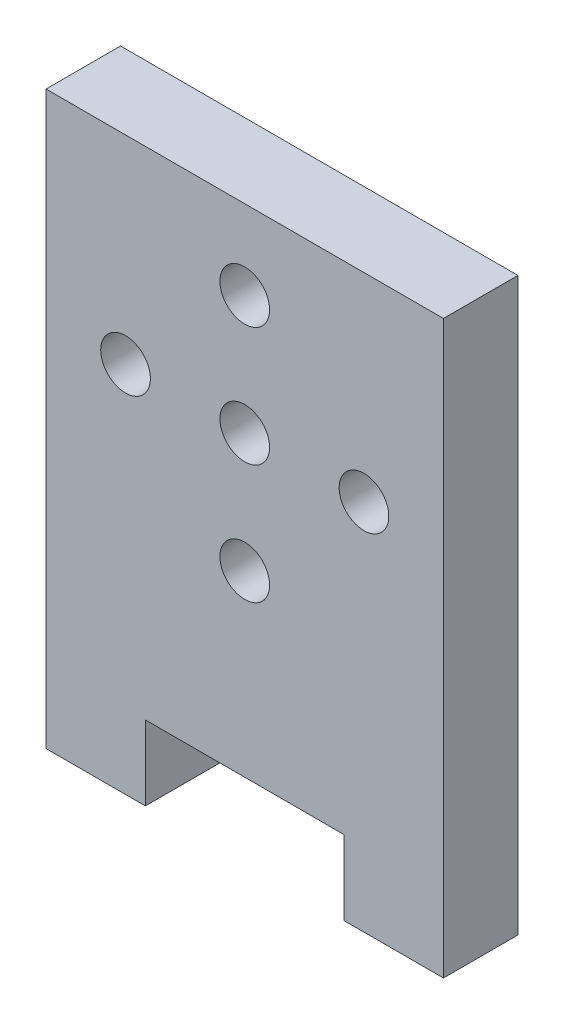
ISO-10303-21;
HEADER;
FILE_DESCRIPTION(('STEP AP214'),'2;1');
FILE_NAME('part.step','',(''),(''),'','','');
FILE_SCHEMA(('AUTOMOTIVE_DESIGN { 1 0 10303 214 1 1 1 1 }'));
ENDSEC;
DATA;
#1=APPLICATION_CONTEXT('core data for automotive mechanical design processes');
#2=APPLICATION_PROTOCOL_DEFINITION('international standard','automotive_design',2000,#1);
#3=PRODUCT_CONTEXT('',#1,'mechanical');
#4=PRODUCT('Part','Part','',(#3));
#5=PRODUCT_RELATED_PRODUCT_CATEGORY('part','',(#4));
#6=PRODUCT_DEFINITION_FORMATION('','',#4);
#7=PRODUCT_DEFINITION_CONTEXT('part definition',#1,'design');
#8=PRODUCT_DEFINITION('design','',#6,#7);
#9=PRODUCT_DEFINITION_SHAPE('','',#8);
#10=(LENGTH_UNIT() NAMED_UNIT(*) SI_UNIT(.MILLI.,.METRE.));
#11=(NAMED_UNIT(*) PLANE_ANGLE_UNIT() SI_UNIT($,.RADIAN.));
#12=(NAMED_UNIT(*) SI_UNIT($,.STERADIAN.) SOLID_ANGLE_UNIT());
#13=UNCERTAINTY_MEASURE_WITH_UNIT(LENGTH_MEASURE(1.E-05),#10,'distance_accuracy_value','');
#14=(GEOMETRIC_REPRESENTATION_CONTEXT(3) GLOBAL_UNCERTAINTY_ASSIGNED_CONTEXT((#13)) GLOBAL_UNIT_ASSIGNED_CONTEXT((#10,
#11,#12)) REPRESENTATION_CONTEXT('',''));
#15=CARTESIAN_POINT('',(0.,0.,0.));
#16=DIRECTION('',(0.,0.,1.));
#17=DIRECTION('',(1.,0.,0.));
#18=AXIS2_PLACEMENT_3D('',#15,#16,#17);
#19=CARTESIAN_POINT('',(0.,0.,4.7625));
#20=DIRECTION('',(0.,0.,-1.));
#21=DIRECTION('',(-1.,0.,0.));
#22=AXIS2_PLACEMENT_3D('',#19,#20,#21);
#23=PLANE('',#22);
#24=DIRECTION('',(0.,1.,0.));
#25=VECTOR('',#24,1.);
#26=CARTESIAN_POINT('',(0.,-4.7625,4.7625));
#27=LINE('',#26,#25);
#28=CARTESIAN_POINT('',(0.,-4.7625,4.7625));
#29=VERTEX_POINT('',#28);
#30=CARTESIAN_POINT('',(0.,0.,4.7625));
#31=VERTEX_POINT('',#30);
#32=EDGE_CURVE('E144',#29,#31,#27,.T.);
#33=ORIENTED_EDGE('',*,*,#32,.T.);
#34=DIRECTION('',(1.,0.,0.));
#35=VECTOR('',#34,1.);
#36=CARTESIAN_POINT('',(0.,0.,4.7625));
#37=LINE('',#36,#35);
#38=CARTESIAN_POINT('',(12.7,0.,4.7625));
#39=VERTEX_POINT('',#38);
#40=EDGE_CURVE('E92',#31,#39,#37,.T.);
#41=ORIENTED_EDGE('',*,*,#40,.T.);
#42=DIRECTION('',(0.,-1.,0.));
#43=VECTOR('',#42,1.);
#44=CARTESIAN_POINT('',(12.7,0.,4.7625));
#45=LINE('',#44,#43);
#46=CARTESIAN_POINT('',(12.7,-4.7625,4.7625));
#47=VERTEX_POINT('',#46);
#48=EDGE_CURVE('E159',#39,#47,#45,.T.);
#49=ORIENTED_EDGE('',*,*,#48,.T.);
#50=DIRECTION('',(1.,0.,0.));
#51=VECTOR('',#50,1.);
#52=CARTESIAN_POINT('',(12.7,-4.7625,4.7625));
#53=LINE('',#52,#51);
#54=CARTESIAN_POINT('',(19.05,-4.7625,4.7625));
#55=VERTEX_POINT('',#54);
#56=EDGE_CURVE('E172',#47,#55,#53,.T.);
#57=ORIENTED_EDGE('',*,*,#56,.T.);
#58=DIRECTION('',(0.,1.,0.));
#59=VECTOR('',#58,1.);
#60=CARTESIAN_POINT('',(19.05,-4.7625,4.7625));
#61=LINE('',#60,#59);
#62=CARTESIAN_POINT('',(19.05,31.75,4.7625));
#63=VERTEX_POINT('',#62);
#64=EDGE_CURVE('E111',#55,#63,#61,.T.);
#65=ORIENTED_EDGE('',*,*,#64,.T.);
#66=DIRECTION('',(-1.,0.,0.));
#67=VECTOR('',#66,1.);
#68=CARTESIAN_POINT('',(19.05,31.75,4.7625));
#69=LINE('',#68,#67);
#70=CARTESIAN_POINT('',(-6.35,31.75,4.7625));
#71=VERTEX_POINT('',#70);
#72=EDGE_CURVE('E105',#63,#71,#69,.T.);
#73=ORIENTED_EDGE('',*,*,#72,.T.);
#74=DIRECTION('',(0.,-1.,0.));
#75=VECTOR('',#74,1.);
#76=CARTESIAN_POINT('',(-6.35,31.75,4.7625));
#77=LINE('',#76,#75);
#78=CARTESIAN_POINT('',(-6.35,-4.7625,4.7625));
#79=VERTEX_POINT('',#78);
#80=EDGE_CURVE('E109',#71,#79,#77,.T.);
#81=ORIENTED_EDGE('',*,*,#80,.T.);
#82=DIRECTION('',(1.,0.,0.));
#83=VECTOR('',#82,1.);
#84=CARTESIAN_POINT('',(-6.35,-4.7625,4.7625));
#85=LINE('',#84,#83);
#86=EDGE_CURVE('E49',#79,#29,#85,.T.);
#87=ORIENTED_EDGE('',*,*,#86,.T.);
#88=EDGE_LOOP('',(#33,#41,#49,#57,#65,#73,#81,#87));
#89=FACE_BOUND('',#88,.T.);
#90=CARTESIAN_POINT('',(6.35,19.05,4.7625));
#91=DIRECTION('',(0.,0.,1.));
#92=DIRECTION('',(1.,0.,0.));
#93=AXIS2_PLACEMENT_3D('',#90,#91,#92);
#94=CIRCLE('',#93,1.5875);
#95=CARTESIAN_POINT('',(4.7625,19.05,4.7625));
#96=VERTEX_POINT('',#95);
#97=EDGE_CURVE('E133',#96,#96,#94,.T.);
#98=ORIENTED_EDGE('',*,*,#97,.F.);
#99=EDGE_LOOP('',(#98));
#100=FACE_BOUND('',#99,.T.);
#101=CARTESIAN_POINT('',(6.35,26.67,4.7625));
#102=DIRECTION('',(0.,0.,1.));
#103=DIRECTION('',(1.,0.,0.));
#104=AXIS2_PLACEMENT_3D('',#101,#102,#103);
#105=CIRCLE('',#104,1.5875);
#106=CARTESIAN_POINT('',(4.7625,26.67,4.7625));
#107=VERTEX_POINT('',#106);
#108=EDGE_CURVE('E181',#107,#107,#105,.T.);
#109=ORIENTED_EDGE('',*,*,#108,.F.);
#110=EDGE_LOOP('',(#109));
#111=FACE_BOUND('',#110,.T.);
#112=CARTESIAN_POINT('',(13.97,19.05,4.7625));
#113=DIRECTION('',(0.,0.,1.));
#114=DIRECTION('',(1.,0.,0.));
#115=AXIS2_PLACEMENT_3D('',#112,#113,#114);
#116=CIRCLE('',#115,1.5875);
#117=CARTESIAN_POINT('',(12.3825,19.05,4.7625));
#118=VERTEX_POINT('',#117);
#119=EDGE_CURVE('E187',#118,#118,#116,.T.);
#120=ORIENTED_EDGE('',*,*,#119,.F.);
#121=EDGE_LOOP('',(#120));
#122=FACE_BOUND('',#121,.T.);
#123=CARTESIAN_POINT('',(-1.27,19.05,4.7625));
#124=DIRECTION('',(0.,0.,1.));
#125=DIRECTION('',(1.,0.,0.));
#126=AXIS2_PLACEMENT_3D('',#123,#124,#125);
#127=CIRCLE('',#126,1.5875);
#128=CARTESIAN_POINT('',(-2.8575,19.05,4.7625));
#129=VERTEX_POINT('',#128);
#130=EDGE_CURVE('E193',#129,#129,#127,.T.);
#131=ORIENTED_EDGE('',*,*,#130,.F.);
#132=EDGE_LOOP('',(#131));
#133=FACE_BOUND('',#132,.T.);
#134=CARTESIAN_POINT('',(6.35,11.43,4.7625));
#135=DIRECTION('',(0.,0.,1.));
#136=DIRECTION('',(1.,0.,0.));
#137=AXIS2_PLACEMENT_3D('',#134,#135,#136);
#138=CIRCLE('',#137,1.5875);
#139=CARTESIAN_POINT('',(4.7625,11.43,4.7625));
#140=VERTEX_POINT('',#139);
#141=EDGE_CURVE('E199',#140,#140,#138,.T.);
#142=ORIENTED_EDGE('',*,*,#141,.F.);
#143=EDGE_LOOP('',(#142));
#144=FACE_BOUND('',#143,.T.);
#145=ADVANCED_FACE('F32',(#89,#100,#111,#122,#133,#144),#23,.F.);
#146=CARTESIAN_POINT('',(0.,0.,0.));
#147=DIRECTION('',(0.,0.,-1.));
#148=DIRECTION('',(-1.,0.,0.));
#149=AXIS2_PLACEMENT_3D('',#146,#147,#148);
#150=PLANE('',#149);
#151=CARTESIAN_POINT('',(-1.27,19.05,0.));
#152=DIRECTION('',(0.,0.,1.));
#153=DIRECTION('',(1.,0.,0.));
#154=AXIS2_PLACEMENT_3D('',#151,#152,#153);
#155=CIRCLE('',#154,1.5875);
#156=CARTESIAN_POINT('',(-2.8575,19.05,0.));
#157=VERTEX_POINT('',#156);
#158=EDGE_CURVE('E196',#157,#157,#155,.T.);
#159=ORIENTED_EDGE('',*,*,#158,.T.);
#160=EDGE_LOOP('',(#159));
#161=FACE_BOUND('',#160,.T.);
#162=CARTESIAN_POINT('',(6.35,26.67,0.));
#163=DIRECTION('',(0.,0.,1.));
#164=DIRECTION('',(1.,0.,0.));
#165=AXIS2_PLACEMENT_3D('',#162,#163,#164);
#166=CIRCLE('',#165,1.5875);
#167=CARTESIAN_POINT('',(4.7625,26.67,0.));
#168=VERTEX_POINT('',#167);
#169=EDGE_CURVE('E184',#168,#168,#166,.T.);
#170=ORIENTED_EDGE('',*,*,#169,.T.);
#171=EDGE_LOOP('',(#170));
#172=FACE_BOUND('',#171,.T.);
#173=DIRECTION('',(0.,1.,0.));
#174=VECTOR('',#173,1.);
#175=CARTESIAN_POINT('',(0.,-4.7625,0.));
#176=LINE('',#175,#174);
#177=CARTESIAN_POINT('',(0.,-4.7625,0.));
#178=VERTEX_POINT('',#177);
#179=CARTESIAN_POINT('',(0.,0.,0.));
#180=VERTEX_POINT('',#179);
#181=EDGE_CURVE('E129',#178,#180,#176,.T.);
#182=ORIENTED_EDGE('',*,*,#181,.F.);
#183=DIRECTION('',(1.,0.,0.));
#184=VECTOR('',#183,1.);
#185=CARTESIAN_POINT('',(-6.35,-4.7625,0.));
#186=LINE('',#185,#184);
#187=CARTESIAN_POINT('',(-6.35,-4.7625,0.));
#188=VERTEX_POINT('',#187);
#189=EDGE_CURVE('E84',#188,#178,#186,.T.);
#190=ORIENTED_EDGE('',*,*,#189,.F.);
#191=DIRECTION('',(0.,-1.,0.));
#192=VECTOR('',#191,1.);
#193=CARTESIAN_POINT('',(-6.35,31.75,0.));
#194=LINE('',#193,#192);
#195=CARTESIAN_POINT('',(-6.35,31.75,0.));
#196=VERTEX_POINT('',#195);
#197=EDGE_CURVE('E78',#196,#188,#194,.T.);
#198=ORIENTED_EDGE('',*,*,#197,.F.);
#199=DIRECTION('',(-1.,0.,0.));
#200=VECTOR('',#199,1.);
#201=CARTESIAN_POINT('',(19.05,31.75,0.));
#202=LINE('',#201,#200);
#203=CARTESIAN_POINT('',(19.05,31.75,0.));
#204=VERTEX_POINT('',#203);
#205=EDGE_CURVE('E119',#204,#196,#202,.T.);
#206=ORIENTED_EDGE('',*,*,#205,.F.);
#207=DIRECTION('',(0.,1.,0.));
#208=VECTOR('',#207,1.);
#209=CARTESIAN_POINT('',(19.05,-4.7625,0.));
#210=LINE('',#209,#208);
#211=CARTESIAN_POINT('',(19.05,-4.7625,0.));
#212=VERTEX_POINT('',#211);
#213=EDGE_CURVE('E139',#212,#204,#210,.T.);
#214=ORIENTED_EDGE('',*,*,#213,.F.);
#215=DIRECTION('',(1.,0.,0.));
#216=VECTOR('',#215,1.);
#217=CARTESIAN_POINT('',(12.7,-4.7625,0.));
#218=LINE('',#217,#216);
#219=CARTESIAN_POINT('',(12.7,-4.7625,0.));
#220=VERTEX_POINT('',#219);
#221=EDGE_CURVE('E137',#220,#212,#218,.T.);
#222=ORIENTED_EDGE('',*,*,#221,.F.);
#223=DIRECTION('',(0.,-1.,0.));
#224=VECTOR('',#223,1.);
#225=CARTESIAN_POINT('',(12.7,0.,0.));
#226=LINE('',#225,#224);
#227=CARTESIAN_POINT('',(12.7,0.,0.));
#228=VERTEX_POINT('',#227);
#229=EDGE_CURVE('E135',#228,#220,#226,.T.);
#230=ORIENTED_EDGE('',*,*,#229,.F.);
#231=DIRECTION('',(1.,0.,0.));
#232=VECTOR('',#231,1.);
#233=CARTESIAN_POINT('',(0.,0.,0.));
#234=LINE('',#233,#232);
#235=EDGE_CURVE('E132',#180,#228,#234,.T.);
#236=ORIENTED_EDGE('',*,*,#235,.F.);
#237=EDGE_LOOP('',(#182,#190,#198,#206,#214,#222,#230,#236));
#238=FACE_BOUND('',#237,.T.);
#239=CARTESIAN_POINT('',(6.35,19.05,0.));
#240=DIRECTION('',(0.,0.,1.));
#241=DIRECTION('',(1.,0.,0.));
#242=AXIS2_PLACEMENT_3D('',#239,#240,#241);
#243=CIRCLE('',#242,1.5875);
#244=CARTESIAN_POINT('',(4.7625,19.05,0.));
#245=VERTEX_POINT('',#244);
#246=EDGE_CURVE('E178',#245,#245,#243,.T.);
#247=ORIENTED_EDGE('',*,*,#246,.T.);
#248=EDGE_LOOP('',(#247));
#249=FACE_BOUND('',#248,.T.);
#250=CARTESIAN_POINT('',(13.97,19.05,0.));
#251=DIRECTION('',(0.,0.,1.));
#252=DIRECTION('',(1.,0.,0.));
#253=AXIS2_PLACEMENT_3D('',#250,#251,#252);
#254=CIRCLE('',#253,1.5875);
#255=CARTESIAN_POINT('',(12.3825,19.05,0.));
#256=VERTEX_POINT('',#255);
#257=EDGE_CURVE('E190',#256,#256,#254,.T.);
#258=ORIENTED_EDGE('',*,*,#257,.T.);
#259=EDGE_LOOP('',(#258));
#260=FACE_BOUND('',#259,.T.);
#261=CARTESIAN_POINT('',(6.35,11.43,0.));
#262=DIRECTION('',(0.,0.,1.));
#263=DIRECTION('',(1.,0.,0.));
#264=AXIS2_PLACEMENT_3D('',#261,#262,#263);
#265=CIRCLE('',#264,1.5875);
#266=CARTESIAN_POINT('',(4.7625,11.43,0.));
#267=VERTEX_POINT('',#266);
#268=EDGE_CURVE('E202',#267,#267,#265,.T.);
#269=ORIENTED_EDGE('',*,*,#268,.T.);
#270=EDGE_LOOP('',(#269));
#271=FACE_BOUND('',#270,.T.);
#272=ADVANCED_FACE('F163',(#161,#172,#238,#249,#260,#271),#150,.T.);
#273=CARTESIAN_POINT('',(0.,-4.7625,4.7625));
#274=DIRECTION('',(-1.,0.,0.));
#275=DIRECTION('',(0.,0.,1.));
#276=AXIS2_PLACEMENT_3D('',#273,#274,#275);
#277=PLANE('',#276);
#278=ORIENTED_EDGE('',*,*,#181,.T.);
#279=DIRECTION('',(0.,0.,-1.));
#280=VECTOR('',#279,1.);
#281=CARTESIAN_POINT('',(0.,0.,4.7625));
#282=LINE('',#281,#280);
#283=EDGE_CURVE('E11',#31,#180,#282,.T.);
#284=ORIENTED_EDGE('',*,*,#283,.F.);
#285=ORIENTED_EDGE('',*,*,#32,.F.);
#286=DIRECTION('',(0.,0.,-1.));
#287=VECTOR('',#286,1.);
#288=CARTESIAN_POINT('',(0.,-4.7625,4.7625));
#289=LINE('',#288,#287);
#290=EDGE_CURVE('E125',#29,#178,#289,.T.);
#291=ORIENTED_EDGE('',*,*,#290,.T.);
#292=EDGE_LOOP('',(#278,#284,#285,#291));
#293=FACE_BOUND('',#292,.T.);
#294=ADVANCED_FACE('F34',(#293),#277,.F.);
#295=CARTESIAN_POINT('',(0.,0.,4.7625));
#296=DIRECTION('',(0.,1.,0.));
#297=DIRECTION('',(0.,0.,1.));
#298=AXIS2_PLACEMENT_3D('',#295,#296,#297);
#299=PLANE('',#298);
#300=ORIENTED_EDGE('',*,*,#235,.T.);
#301=DIRECTION('',(0.,0.,-1.));
#302=VECTOR('',#301,1.);
#303=CARTESIAN_POINT('',(12.7,0.,4.7625));
#304=LINE('',#303,#302);
#305=EDGE_CURVE('E41',#39,#228,#304,.T.);
#306=ORIENTED_EDGE('',*,*,#305,.F.);
#307=ORIENTED_EDGE('',*,*,#40,.F.);
#308=ORIENTED_EDGE('',*,*,#283,.T.);
#309=EDGE_LOOP('',(#300,#306,#307,#308));
#310=FACE_BOUND('',#309,.T.);
#311=ADVANCED_FACE('F234',(#310),#299,.F.);
#312=CARTESIAN_POINT('',(12.7,0.,4.7625));
#313=DIRECTION('',(1.,0.,0.));
#314=DIRECTION('',(0.,0.,-1.));
#315=AXIS2_PLACEMENT_3D('',#312,#313,#314);
#316=PLANE('',#315);
#317=ORIENTED_EDGE('',*,*,#229,.T.);
#318=DIRECTION('',(0.,0.,-1.));
#319=VECTOR('',#318,1.);
#320=CARTESIAN_POINT('',(12.7,-4.7625,4.7625));
#321=LINE('',#320,#319);
#322=EDGE_CURVE('E151',#47,#220,#321,.T.);
#323=ORIENTED_EDGE('',*,*,#322,.F.);
#324=ORIENTED_EDGE('',*,*,#48,.F.);
#325=ORIENTED_EDGE('',*,*,#305,.T.);
#326=EDGE_LOOP('',(#317,#323,#324,#325));
#327=FACE_BOUND('',#326,.T.);
#328=ADVANCED_FACE('F157',(#327),#316,.F.);
#329=CARTESIAN_POINT('',(12.7,-4.7625,4.7625));
#330=DIRECTION('',(0.,1.,0.));
#331=DIRECTION('',(0.,0.,1.));
#332=AXIS2_PLACEMENT_3D('',#329,#330,#331);
#333=PLANE('',#332);
#334=ORIENTED_EDGE('',*,*,#221,.T.);
#335=DIRECTION('',(0.,0.,-1.));
#336=VECTOR('',#335,1.);
#337=CARTESIAN_POINT('',(19.05,-4.7625,4.7625));
#338=LINE('',#337,#336);
#339=EDGE_CURVE('E148',#55,#212,#338,.T.);
#340=ORIENTED_EDGE('',*,*,#339,.F.);
#341=ORIENTED_EDGE('',*,*,#56,.F.);
#342=ORIENTED_EDGE('',*,*,#322,.T.);
#343=EDGE_LOOP('',(#334,#340,#341,#342));
#344=FACE_BOUND('',#343,.T.);
#345=ADVANCED_FACE('F168',(#344),#333,.F.);
#346=CARTESIAN_POINT('',(19.05,-4.7625,4.7625));
#347=DIRECTION('',(-1.,0.,0.));
#348=DIRECTION('',(0.,-1.,0.));
#349=AXIS2_PLACEMENT_3D('',#346,#347,#348);
#350=PLANE('',#349);
#351=ORIENTED_EDGE('',*,*,#213,.T.);
#352=DIRECTION('',(0.,0.,-1.));
#353=VECTOR('',#352,1.);
#354=CARTESIAN_POINT('',(19.05,31.75,4.7625));
#355=LINE('',#354,#353);
#356=EDGE_CURVE('E120',#63,#204,#355,.T.);
#357=ORIENTED_EDGE('',*,*,#356,.F.);
#358=ORIENTED_EDGE('',*,*,#64,.F.);
#359=ORIENTED_EDGE('',*,*,#339,.T.);
#360=EDGE_LOOP('',(#351,#357,#358,#359));
#361=FACE_BOUND('',#360,.T.);
#362=ADVANCED_FACE('F171',(#361),#350,.F.);
#363=CARTESIAN_POINT('',(19.05,31.75,4.7625));
#364=DIRECTION('',(0.,-1.,0.));
#365=DIRECTION('',(0.,0.,-1.));
#366=AXIS2_PLACEMENT_3D('',#363,#364,#365);
#367=PLANE('',#366);
#368=ORIENTED_EDGE('',*,*,#205,.T.);
#369=DIRECTION('',(0.,0.,-1.));
#370=VECTOR('',#369,1.);
#371=CARTESIAN_POINT('',(-6.35,31.75,4.7625));
#372=LINE('',#371,#370);
#373=EDGE_CURVE('E116',#71,#196,#372,.T.);
#374=ORIENTED_EDGE('',*,*,#373,.F.);
#375=ORIENTED_EDGE('',*,*,#72,.F.);
#376=ORIENTED_EDGE('',*,*,#356,.T.);
#377=EDGE_LOOP('',(#368,#374,#375,#376));
#378=FACE_BOUND('',#377,.T.);
#379=ADVANCED_FACE('F117',(#378),#367,.F.);
#380=CARTESIAN_POINT('',(-6.35,31.75,4.7625));
#381=DIRECTION('',(1.,0.,0.));
#382=DIRECTION('',(0.,1.,0.));
#383=AXIS2_PLACEMENT_3D('',#380,#381,#382);
#384=PLANE('',#383);
#385=ORIENTED_EDGE('',*,*,#197,.T.);
#386=DIRECTION('',(0.,0.,-1.));
#387=VECTOR('',#386,1.);
#388=CARTESIAN_POINT('',(-6.35,-4.7625,4.7625));
#389=LINE('',#388,#387);
#390=EDGE_CURVE('E121',#79,#188,#389,.T.);
#391=ORIENTED_EDGE('',*,*,#390,.F.);
#392=ORIENTED_EDGE('',*,*,#80,.F.);
#393=ORIENTED_EDGE('',*,*,#373,.T.);
#394=EDGE_LOOP('',(#385,#391,#392,#393));
#395=FACE_BOUND('',#394,.T.);
#396=ADVANCED_FACE('F123',(#395),#384,.F.);
#397=CARTESIAN_POINT('',(-6.35,-4.7625,4.7625));
#398=DIRECTION('',(0.,1.,0.));
#399=DIRECTION('',(0.,0.,1.));
#400=AXIS2_PLACEMENT_3D('',#397,#398,#399);
#401=PLANE('',#400);
#402=ORIENTED_EDGE('',*,*,#189,.T.);
#403=ORIENTED_EDGE('',*,*,#290,.F.);
#404=ORIENTED_EDGE('',*,*,#86,.F.);
#405=ORIENTED_EDGE('',*,*,#390,.T.);
#406=EDGE_LOOP('',(#402,#403,#404,#405));
#407=FACE_BOUND('',#406,.T.);
#408=ADVANCED_FACE('F222',(#407),#401,.F.);
#409=CARTESIAN_POINT('',(6.35,19.05,4.7625));
#410=DIRECTION('',(0.,0.,-1.));
#411=DIRECTION('',(-1.,0.,0.));
#412=AXIS2_PLACEMENT_3D('',#409,#410,#411);
#413=CYLINDRICAL_SURFACE('',#412,1.5875);
#414=CARTESIAN_POINT('',(4.7625,19.05,4.7625));
#415=CARTESIAN_POINT('',(4.7625,19.05,4.712890625));
#416=CARTESIAN_POINT('',(4.7625,19.05,4.66328125));
#417=CARTESIAN_POINT('',(4.7625,19.05,4.5640625));
#418=CARTESIAN_POINT('',(4.7625,19.05,4.514453125));
#419=CARTESIAN_POINT('',(4.7625,19.05,4.415234375));
#420=CARTESIAN_POINT('',(4.7625,19.05,4.365625));
#421=CARTESIAN_POINT('',(4.7625,19.05,4.26640625));
#422=CARTESIAN_POINT('',(4.7625,19.05,4.216796875));
#423=CARTESIAN_POINT('',(4.7625,19.05,4.117578125));
#424=CARTESIAN_POINT('',(4.7625,19.05,4.06796875));
#425=CARTESIAN_POINT('',(4.7625,19.05,3.96875));
#426=CARTESIAN_POINT('',(4.7625,19.05,3.919140625));
#427=CARTESIAN_POINT('',(4.7625,19.05,3.819921875));
#428=CARTESIAN_POINT('',(4.7625,19.05,3.7703125));
#429=CARTESIAN_POINT('',(4.7625,19.05,3.67109375));
#430=CARTESIAN_POINT('',(4.7625,19.05,3.621484375));
#431=CARTESIAN_POINT('',(4.7625,19.05,3.522265625));
#432=CARTESIAN_POINT('',(4.7625,19.05,3.47265625));
#433=CARTESIAN_POINT('',(4.7625,19.05,3.3734375));
#434=CARTESIAN_POINT('',(4.7625,19.05,3.323828125));
#435=CARTESIAN_POINT('',(4.7625,19.05,3.224609375));
#436=CARTESIAN_POINT('',(4.7625,19.05,3.175));
#437=CARTESIAN_POINT('',(4.7625,19.05,3.07578125));
#438=CARTESIAN_POINT('',(4.7625,19.05,3.026171875));
#439=CARTESIAN_POINT('',(4.7625,19.05,2.926953125));
#440=CARTESIAN_POINT('',(4.7625,19.05,2.87734375));
#441=CARTESIAN_POINT('',(4.7625,19.05,2.778125));
#442=CARTESIAN_POINT('',(4.7625,19.05,2.728515625));
#443=CARTESIAN_POINT('',(4.7625,19.05,2.629296875));
#444=CARTESIAN_POINT('',(4.7625,19.05,2.5796875));
#445=CARTESIAN_POINT('',(4.7625,19.05,2.48046875));
#446=CARTESIAN_POINT('',(4.7625,19.05,2.430859375));
#447=CARTESIAN_POINT('',(4.7625,19.05,2.331640625));
#448=CARTESIAN_POINT('',(4.7625,19.05,2.28203125));
#449=CARTESIAN_POINT('',(4.7625,19.05,2.1828125));
#450=CARTESIAN_POINT('',(4.7625,19.05,2.133203125));
#451=CARTESIAN_POINT('',(4.7625,19.05,2.033984375));
#452=CARTESIAN_POINT('',(4.7625,19.05,1.984375));
#453=CARTESIAN_POINT('',(4.7625,19.05,1.88515625));
#454=CARTESIAN_POINT('',(4.7625,19.05,1.835546875));
#455=CARTESIAN_POINT('',(4.7625,19.05,1.736328125));
#456=CARTESIAN_POINT('',(4.7625,19.05,1.68671875));
#457=CARTESIAN_POINT('',(4.7625,19.05,1.5875));
#458=CARTESIAN_POINT('',(4.7625,19.05,1.537890625));
#459=CARTESIAN_POINT('',(4.7625,19.05,1.438671875));
#460=CARTESIAN_POINT('',(4.7625,19.05,1.3890625));
#461=CARTESIAN_POINT('',(4.7625,19.05,1.28984375));
#462=CARTESIAN_POINT('',(4.7625,19.05,1.240234375));
#463=CARTESIAN_POINT('',(4.7625,19.05,1.141015625));
#464=CARTESIAN_POINT('',(4.7625,19.05,1.09140625));
#465=CARTESIAN_POINT('',(4.7625,19.05,0.992187499999999));
#466=CARTESIAN_POINT('',(4.7625,19.05,0.942578124999999));
#467=CARTESIAN_POINT('',(4.7625,19.05,0.843359375));
#468=CARTESIAN_POINT('',(4.7625,19.05,0.79375));
#469=CARTESIAN_POINT('',(4.7625,19.05,0.69453125));
#470=CARTESIAN_POINT('',(4.7625,19.05,0.644921875));
#471=CARTESIAN_POINT('',(4.7625,19.05,0.545703125));
#472=CARTESIAN_POINT('',(4.7625,19.05,0.49609375));
#473=CARTESIAN_POINT('',(4.7625,19.05,0.396875));
#474=CARTESIAN_POINT('',(4.7625,19.05,0.347265625));
#475=CARTESIAN_POINT('',(4.7625,19.05,0.248046875));
#476=CARTESIAN_POINT('',(4.7625,19.05,0.1984375));
#477=CARTESIAN_POINT('',(4.7625,19.05,0.09921875));
#478=CARTESIAN_POINT('',(4.7625,19.05,0.049609375));
#479=CARTESIAN_POINT('',(4.7625,19.05,0.));
#480=B_SPLINE_CURVE_WITH_KNOTS('',3,(#414,#415,#416,#417,#418,#419,#420,#421,#422,#423,#424,
#425,#426,#427,#428,#429,#430,#431,#432,#433,#434,#435,#436,#437,#438,#439,#440,#441,#442,#443,
#444,#445,#446,#447,#448,#449,#450,#451,#452,#453,#454,#455,#456,#457,#458,#459,#460,#461,#462,
#463,#464,#465,#466,#467,#468,#469,#470,#471,#472,#473,#474,#475,#476,#477,#478,#479),
.UNSPECIFIED.,.F.,.F.,(4,2,2,2,2,2,2,2,2,2,2,2,2,2,2,2,2,2,2,2,2,2,2,2,2,2,2,2,2,2,2,2,4),(0.,
0.148828125,0.29765625,0.446484375,0.5953125,0.744140625,0.892968750000001,1.041796875,1.190625,
1.339453125,1.48828125,1.637109375,1.7859375,1.934765625,2.08359375,2.232421875,2.38125,
2.530078125,2.67890625,2.827734375,2.9765625,3.125390625,3.27421875,3.423046875,3.571875,
3.720703125,3.86953125,4.018359375,4.1671875,4.316015625,4.46484375,4.613671875,4.7625),.UNSPECIFIED.);
#481=EDGE_CURVE('BSEAM219',#96,#245,#480,.T.);
#482=ORIENTED_EDGE('',*,*,#97,.T.);
#483=ORIENTED_EDGE('',*,*,#246,.F.);
#484=ORIENTED_EDGE('',*,*,#481,.T.);
#485=ORIENTED_EDGE('',*,*,#481,.F.);
#486=EDGE_LOOP('',(#482,#484,#483,#485));
#487=FACE_BOUND('',#486,.T.);
#488=ADVANCED_FACE('F219',(#487),#413,.F.);
#489=CARTESIAN_POINT('',(6.35,26.67,4.7625));
#490=DIRECTION('',(0.,0.,-1.));
#491=DIRECTION('',(-1.,0.,0.));
#492=AXIS2_PLACEMENT_3D('',#489,#490,#491);
#493=CYLINDRICAL_SURFACE('',#492,1.5875);
#494=CARTESIAN_POINT('',(4.7625,26.67,4.7625));
#495=CARTESIAN_POINT('',(4.7625,26.67,4.712890625));
#496=CARTESIAN_POINT('',(4.7625,26.67,4.66328125));
#497=CARTESIAN_POINT('',(4.7625,26.67,4.5640625));
#498=CARTESIAN_POINT('',(4.7625,26.67,4.514453125));
#499=CARTESIAN_POINT('',(4.7625,26.67,4.415234375));
#500=CARTESIAN_POINT('',(4.7625,26.67,4.365625));
#501=CARTESIAN_POINT('',(4.7625,26.67,4.26640625));
#502=CARTESIAN_POINT('',(4.7625,26.67,4.216796875));
#503=CARTESIAN_POINT('',(4.7625,26.67,4.117578125));
#504=CARTESIAN_POINT('',(4.7625,26.67,4.06796875));
#505=CARTESIAN_POINT('',(4.7625,26.67,3.96875));
#506=CARTESIAN_POINT('',(4.7625,26.67,3.919140625));
#507=CARTESIAN_POINT('',(4.7625,26.67,3.819921875));
#508=CARTESIAN_POINT('',(4.7625,26.67,3.7703125));
#509=CARTESIAN_POINT('',(4.7625,26.67,3.67109375));
#510=CARTESIAN_POINT('',(4.7625,26.67,3.621484375));
#511=CARTESIAN_POINT('',(4.7625,26.67,3.522265625));
#512=CARTESIAN_POINT('',(4.7625,26.67,3.47265625));
#513=CARTESIAN_POINT('',(4.7625,26.67,3.3734375));
#514=CARTESIAN_POINT('',(4.7625,26.67,3.323828125));
#515=CARTESIAN_POINT('',(4.7625,26.67,3.224609375));
#516=CARTESIAN_POINT('',(4.7625,26.67,3.175));
#517=CARTESIAN_POINT('',(4.7625,26.67,3.07578125));
#518=CARTESIAN_POINT('',(4.7625,26.67,3.026171875));
#519=CARTESIAN_POINT('',(4.7625,26.67,2.926953125));
#520=CARTESIAN_POINT('',(4.7625,26.67,2.87734375));
#521=CARTESIAN_POINT('',(4.7625,26.67,2.778125));
#522=CARTESIAN_POINT('',(4.7625,26.67,2.728515625));
#523=CARTESIAN_POINT('',(4.7625,26.67,2.629296875));
#524=CARTESIAN_POINT('',(4.7625,26.67,2.5796875));
#525=CARTESIAN_POINT('',(4.7625,26.67,2.48046875));
#526=CARTESIAN_POINT('',(4.7625,26.67,2.430859375));
#527=CARTESIAN_POINT('',(4.7625,26.67,2.331640625));
#528=CARTESIAN_POINT('',(4.7625,26.67,2.28203125));
#529=CARTESIAN_POINT('',(4.7625,26.67,2.1828125));
#530=CARTESIAN_POINT('',(4.7625,26.67,2.133203125));
#531=CARTESIAN_POINT('',(4.7625,26.67,2.033984375));
#532=CARTESIAN_POINT('',(4.7625,26.67,1.984375));
#533=CARTESIAN_POINT('',(4.7625,26.67,1.88515625));
#534=CARTESIAN_POINT('',(4.7625,26.67,1.835546875));
#535=CARTESIAN_POINT('',(4.7625,26.67,1.736328125));
#536=CARTESIAN_POINT('',(4.7625,26.67,1.68671875));
#537=CARTESIAN_POINT('',(4.7625,26.67,1.5875));
#538=CARTESIAN_POINT('',(4.7625,26.67,1.537890625));
#539=CARTESIAN_POINT('',(4.7625,26.67,1.438671875));
#540=CARTESIAN_POINT('',(4.7625,26.67,1.3890625));
#541=CARTESIAN_POINT('',(4.7625,26.67,1.28984375));
#542=CARTESIAN_POINT('',(4.7625,26.67,1.240234375));
#543=CARTESIAN_POINT('',(4.7625,26.67,1.141015625));
#544=CARTESIAN_POINT('',(4.7625,26.67,1.09140625));
#545=CARTESIAN_POINT('',(4.7625,26.67,0.992187499999999));
#546=CARTESIAN_POINT('',(4.7625,26.67,0.942578124999999));
#547=CARTESIAN_POINT('',(4.7625,26.67,0.843359375));
#548=CARTESIAN_POINT('',(4.7625,26.67,0.79375));
#549=CARTESIAN_POINT('',(4.7625,26.67,0.69453125));
#550=CARTESIAN_POINT('',(4.7625,26.67,0.644921875));
#551=CARTESIAN_POINT('',(4.7625,26.67,0.545703125));
#552=CARTESIAN_POINT('',(4.7625,26.67,0.49609375));
#553=CARTESIAN_POINT('',(4.7625,26.67,0.396875));
#554=CARTESIAN_POINT('',(4.7625,26.67,0.347265625));
#555=CARTESIAN_POINT('',(4.7625,26.67,0.248046875));
#556=CARTESIAN_POINT('',(4.7625,26.67,0.1984375));
#557=CARTESIAN_POINT('',(4.7625,26.67,0.09921875));
#558=CARTESIAN_POINT('',(4.7625,26.67,0.049609375));
#559=CARTESIAN_POINT('',(4.7625,26.67,0.));
#560=B_SPLINE_CURVE_WITH_KNOTS('',3,(#494,#495,#496,#497,#498,#499,#500,#501,#502,#503,#504,
#505,#506,#507,#508,#509,#510,#511,#512,#513,#514,#515,#516,#517,#518,#519,#520,#521,#522,#523,
#524,#525,#526,#527,#528,#529,#530,#531,#532,#533,#534,#535,#536,#537,#538,#539,#540,#541,#542,
#543,#544,#545,#546,#547,#548,#549,#550,#551,#552,#553,#554,#555,#556,#557,#558,#559),
.UNSPECIFIED.,.F.,.F.,(4,2,2,2,2,2,2,2,2,2,2,2,2,2,2,2,2,2,2,2,2,2,2,2,2,2,2,2,2,2,2,2,4),(0.,
0.148828125,0.29765625,0.446484375,0.5953125,0.744140625,0.892968750000001,1.041796875,1.190625,
1.339453125,1.48828125,1.637109375,1.7859375,1.934765625,2.08359375,2.232421875,2.38125,
2.530078125,2.67890625,2.827734375,2.9765625,3.125390625,3.27421875,3.423046875,3.571875,
3.720703125,3.86953125,4.018359375,4.1671875,4.316015625,4.46484375,4.613671875,4.7625),.UNSPECIFIED.);
#561=EDGE_CURVE('BSEAM298',#107,#168,#560,.T.);
#562=ORIENTED_EDGE('',*,*,#108,.T.);
#563=ORIENTED_EDGE('',*,*,#169,.F.);
#564=ORIENTED_EDGE('',*,*,#561,.T.);
#565=ORIENTED_EDGE('',*,*,#561,.F.);
#566=EDGE_LOOP('',(#562,#564,#563,#565));
#567=FACE_BOUND('',#566,.T.);
#568=ADVANCED_FACE('F298',(#567),#493,.F.);
#569=CARTESIAN_POINT('',(13.97,19.05,4.7625));
#570=DIRECTION('',(0.,0.,-1.));
#571=DIRECTION('',(-1.,0.,0.));
#572=AXIS2_PLACEMENT_3D('',#569,#570,#571);
#573=CYLINDRICAL_SURFACE('',#572,1.5875);
#574=CARTESIAN_POINT('',(12.3825,19.05,4.7625));
#575=CARTESIAN_POINT('',(12.3825,19.05,4.712890625));
#576=CARTESIAN_POINT('',(12.3825,19.05,4.66328125));
#577=CARTESIAN_POINT('',(12.3825,19.05,4.5640625));
#578=CARTESIAN_POINT('',(12.3825,19.05,4.514453125));
#579=CARTESIAN_POINT('',(12.3825,19.05,4.415234375));
#580=CARTESIAN_POINT('',(12.3825,19.05,4.365625));
#581=CARTESIAN_POINT('',(12.3825,19.05,4.26640625));
#582=CARTESIAN_POINT('',(12.3825,19.05,4.216796875));
#583=CARTESIAN_POINT('',(12.3825,19.05,4.117578125));
#584=CARTESIAN_POINT('',(12.3825,19.05,4.06796875));
#585=CARTESIAN_POINT('',(12.3825,19.05,3.96875));
#586=CARTESIAN_POINT('',(12.3825,19.05,3.919140625));
#587=CARTESIAN_POINT('',(12.3825,19.05,3.819921875));
#588=CARTESIAN_POINT('',(12.3825,19.05,3.7703125));
#589=CARTESIAN_POINT('',(12.3825,19.05,3.67109375));
#590=CARTESIAN_POINT('',(12.3825,19.05,3.621484375));
#591=CARTESIAN_POINT('',(12.3825,19.05,3.522265625));
#592=CARTESIAN_POINT('',(12.3825,19.05,3.47265625));
#593=CARTESIAN_POINT('',(12.3825,19.05,3.3734375));
#594=CARTESIAN_POINT('',(12.3825,19.05,3.323828125));
#595=CARTESIAN_POINT('',(12.3825,19.05,3.224609375));
#596=CARTESIAN_POINT('',(12.3825,19.05,3.175));
#597=CARTESIAN_POINT('',(12.3825,19.05,3.07578125));
#598=CARTESIAN_POINT('',(12.3825,19.05,3.026171875));
#599=CARTESIAN_POINT('',(12.3825,19.05,2.926953125));
#600=CARTESIAN_POINT('',(12.3825,19.05,2.87734375));
#601=CARTESIAN_POINT('',(12.3825,19.05,2.778125));
#602=CARTESIAN_POINT('',(12.3825,19.05,2.728515625));
#603=CARTESIAN_POINT('',(12.3825,19.05,2.629296875));
#604=CARTESIAN_POINT('',(12.3825,19.05,2.5796875));
#605=CARTESIAN_POINT('',(12.3825,19.05,2.48046875));
#606=CARTESIAN_POINT('',(12.3825,19.05,2.430859375));
#607=CARTESIAN_POINT('',(12.3825,19.05,2.331640625));
#608=CARTESIAN_POINT('',(12.3825,19.05,2.28203125));
#609=CARTESIAN_POINT('',(12.3825,19.05,2.1828125));
#610=CARTESIAN_POINT('',(12.3825,19.05,2.133203125));
#611=CARTESIAN_POINT('',(12.3825,19.05,2.033984375));
#612=CARTESIAN_POINT('',(12.3825,19.05,1.984375));
#613=CARTESIAN_POINT('',(12.3825,19.05,1.88515625));
#614=CARTESIAN_POINT('',(12.3825,19.05,1.835546875));
#615=CARTESIAN_POINT('',(12.3825,19.05,1.736328125));
#616=CARTESIAN_POINT('',(12.3825,19.05,1.68671875));
#617=CARTESIAN_POINT('',(12.3825,19.05,1.5875));
#618=CARTESIAN_POINT('',(12.3825,19.05,1.537890625));
#619=CARTESIAN_POINT('',(12.3825,19.05,1.438671875));
#620=CARTESIAN_POINT('',(12.3825,19.05,1.3890625));
#621=CARTESIAN_POINT('',(12.3825,19.05,1.28984375));
#622=CARTESIAN_POINT('',(12.3825,19.05,1.240234375));
#623=CARTESIAN_POINT('',(12.3825,19.05,1.141015625));
#624=CARTESIAN_POINT('',(12.3825,19.05,1.09140625));
#625=CARTESIAN_POINT('',(12.3825,19.05,0.992187499999999));
#626=CARTESIAN_POINT('',(12.3825,19.05,0.942578124999999));
#627=CARTESIAN_POINT('',(12.3825,19.05,0.843359375));
#628=CARTESIAN_POINT('',(12.3825,19.05,0.79375));
#629=CARTESIAN_POINT('',(12.3825,19.05,0.69453125));
#630=CARTESIAN_POINT('',(12.3825,19.05,0.644921875));
#631=CARTESIAN_POINT('',(12.3825,19.05,0.545703125));
#632=CARTESIAN_POINT('',(12.3825,19.05,0.49609375));
#633=CARTESIAN_POINT('',(12.3825,19.05,0.396875));
#634=CARTESIAN_POINT('',(12.3825,19.05,0.347265625));
#635=CARTESIAN_POINT('',(12.3825,19.05,0.248046875));
#636=CARTESIAN_POINT('',(12.3825,19.05,0.1984375));
#637=CARTESIAN_POINT('',(12.3825,19.05,0.09921875));
#638=CARTESIAN_POINT('',(12.3825,19.05,0.049609375));
#639=CARTESIAN_POINT('',(12.3825,19.05,0.));
#640=B_SPLINE_CURVE_WITH_KNOTS('',3,(#574,#575,#576,#577,#578,#579,#580,#581,#582,#583,#584,
#585,#586,#587,#588,#589,#590,#591,#592,#593,#594,#595,#596,#597,#598,#599,#600,#601,#602,#603,
#604,#605,#606,#607,#608,#609,#610,#611,#612,#613,#614,#615,#616,#617,#618,#619,#620,#621,#622,
#623,#624,#625,#626,#627,#628,#629,#630,#631,#632,#633,#634,#635,#636,#637,#638,#639),
.UNSPECIFIED.,.F.,.F.,(4,2,2,2,2,2,2,2,2,2,2,2,2,2,2,2,2,2,2,2,2,2,2,2,2,2,2,2,2,2,2,2,4),(0.,
0.148828125,0.29765625,0.446484375,0.5953125,0.744140625,0.892968750000001,1.041796875,1.190625,
1.339453125,1.48828125,1.637109375,1.7859375,1.934765625,2.08359375,2.232421875,2.38125,
2.530078125,2.67890625,2.827734375,2.9765625,3.125390625,3.27421875,3.423046875,3.571875,
3.720703125,3.86953125,4.018359375,4.1671875,4.316015625,4.46484375,4.613671875,4.7625),.UNSPECIFIED.);
#641=EDGE_CURVE('BSEAM306',#118,#256,#640,.T.);
#642=ORIENTED_EDGE('',*,*,#119,.T.);
#643=ORIENTED_EDGE('',*,*,#257,.F.);
#644=ORIENTED_EDGE('',*,*,#641,.T.);
#645=ORIENTED_EDGE('',*,*,#641,.F.);
#646=EDGE_LOOP('',(#642,#644,#643,#645));
#647=FACE_BOUND('',#646,.T.);
#648=ADVANCED_FACE('F306',(#647),#573,.F.);
#649=CARTESIAN_POINT('',(-1.27,19.05,4.7625));
#650=DIRECTION('',(0.,0.,-1.));
#651=DIRECTION('',(-1.,0.,0.));
#652=AXIS2_PLACEMENT_3D('',#649,#650,#651);
#653=CYLINDRICAL_SURFACE('',#652,1.5875);
#654=CARTESIAN_POINT('',(-2.8575,19.05,4.7625));
#655=CARTESIAN_POINT('',(-2.8575,19.05,4.712890625));
#656=CARTESIAN_POINT('',(-2.8575,19.05,4.66328125));
#657=CARTESIAN_POINT('',(-2.8575,19.05,4.5640625));
#658=CARTESIAN_POINT('',(-2.8575,19.05,4.514453125));
#659=CARTESIAN_POINT('',(-2.8575,19.05,4.415234375));
#660=CARTESIAN_POINT('',(-2.8575,19.05,4.365625));
#661=CARTESIAN_POINT('',(-2.8575,19.05,4.26640625));
#662=CARTESIAN_POINT('',(-2.8575,19.05,4.216796875));
#663=CARTESIAN_POINT('',(-2.8575,19.05,4.117578125));
#664=CARTESIAN_POINT('',(-2.8575,19.05,4.06796875));
#665=CARTESIAN_POINT('',(-2.8575,19.05,3.96875));
#666=CARTESIAN_POINT('',(-2.8575,19.05,3.919140625));
#667=CARTESIAN_POINT('',(-2.8575,19.05,3.819921875));
#668=CARTESIAN_POINT('',(-2.8575,19.05,3.7703125));
#669=CARTESIAN_POINT('',(-2.8575,19.05,3.67109375));
#670=CARTESIAN_POINT('',(-2.8575,19.05,3.621484375));
#671=CARTESIAN_POINT('',(-2.8575,19.05,3.522265625));
#672=CARTESIAN_POINT('',(-2.8575,19.05,3.47265625));
#673=CARTESIAN_POINT('',(-2.8575,19.05,3.3734375));
#674=CARTESIAN_POINT('',(-2.8575,19.05,3.323828125));
#675=CARTESIAN_POINT('',(-2.8575,19.05,3.224609375));
#676=CARTESIAN_POINT('',(-2.8575,19.05,3.175));
#677=CARTESIAN_POINT('',(-2.8575,19.05,3.07578125));
#678=CARTESIAN_POINT('',(-2.8575,19.05,3.026171875));
#679=CARTESIAN_POINT('',(-2.8575,19.05,2.926953125));
#680=CARTESIAN_POINT('',(-2.8575,19.05,2.87734375));
#681=CARTESIAN_POINT('',(-2.8575,19.05,2.778125));
#682=CARTESIAN_POINT('',(-2.8575,19.05,2.728515625));
#683=CARTESIAN_POINT('',(-2.8575,19.05,2.629296875));
#684=CARTESIAN_POINT('',(-2.8575,19.05,2.5796875));
#685=CARTESIAN_POINT('',(-2.8575,19.05,2.48046875));
#686=CARTESIAN_POINT('',(-2.8575,19.05,2.430859375));
#687=CARTESIAN_POINT('',(-2.8575,19.05,2.331640625));
#688=CARTESIAN_POINT('',(-2.8575,19.05,2.28203125));
#689=CARTESIAN_POINT('',(-2.8575,19.05,2.1828125));
#690=CARTESIAN_POINT('',(-2.8575,19.05,2.133203125));
#691=CARTESIAN_POINT('',(-2.8575,19.05,2.033984375));
#692=CARTESIAN_POINT('',(-2.8575,19.05,1.984375));
#693=CARTESIAN_POINT('',(-2.8575,19.05,1.88515625));
#694=CARTESIAN_POINT('',(-2.8575,19.05,1.835546875));
#695=CARTESIAN_POINT('',(-2.8575,19.05,1.736328125));
#696=CARTESIAN_POINT('',(-2.8575,19.05,1.68671875));
#697=CARTESIAN_POINT('',(-2.8575,19.05,1.5875));
#698=CARTESIAN_POINT('',(-2.8575,19.05,1.537890625));
#699=CARTESIAN_POINT('',(-2.8575,19.05,1.438671875));
#700=CARTESIAN_POINT('',(-2.8575,19.05,1.3890625));
#701=CARTESIAN_POINT('',(-2.8575,19.05,1.28984375));
#702=CARTESIAN_POINT('',(-2.8575,19.05,1.240234375));
#703=CARTESIAN_POINT('',(-2.8575,19.05,1.141015625));
#704=CARTESIAN_POINT('',(-2.8575,19.05,1.09140625));
#705=CARTESIAN_POINT('',(-2.8575,19.05,0.992187499999999));
#706=CARTESIAN_POINT('',(-2.8575,19.05,0.942578124999999));
#707=CARTESIAN_POINT('',(-2.8575,19.05,0.843359375));
#708=CARTESIAN_POINT('',(-2.8575,19.05,0.79375));
#709=CARTESIAN_POINT('',(-2.8575,19.05,0.69453125));
#710=CARTESIAN_POINT('',(-2.8575,19.05,0.644921875));
#711=CARTESIAN_POINT('',(-2.8575,19.05,0.545703125));
#712=CARTESIAN_POINT('',(-2.8575,19.05,0.49609375));
#713=CARTESIAN_POINT('',(-2.8575,19.05,0.396875));
#714=CARTESIAN_POINT('',(-2.8575,19.05,0.347265625));
#715=CARTESIAN_POINT('',(-2.8575,19.05,0.248046875));
#716=CARTESIAN_POINT('',(-2.8575,19.05,0.1984375));
#717=CARTESIAN_POINT('',(-2.8575,19.05,0.09921875));
#718=CARTESIAN_POINT('',(-2.8575,19.05,0.049609375));
#719=CARTESIAN_POINT('',(-2.8575,19.05,0.));
#720=B_SPLINE_CURVE_WITH_KNOTS('',3,(#654,#655,#656,#657,#658,#659,#660,#661,#662,#663,#664,
#665,#666,#667,#668,#669,#670,#671,#672,#673,#674,#675,#676,#677,#678,#679,#680,#681,#682,#683,
#684,#685,#686,#687,#688,#689,#690,#691,#692,#693,#694,#695,#696,#697,#698,#699,#700,#701,#702,
#703,#704,#705,#706,#707,#708,#709,#710,#711,#712,#713,#714,#715,#716,#717,#718,#719),
.UNSPECIFIED.,.F.,.F.,(4,2,2,2,2,2,2,2,2,2,2,2,2,2,2,2,2,2,2,2,2,2,2,2,2,2,2,2,2,2,2,2,4),(0.,
0.148828125,0.29765625,0.446484375,0.5953125,0.744140625,0.892968750000001,1.041796875,1.190625,
1.339453125,1.48828125,1.637109375,1.7859375,1.934765625,2.08359375,2.232421875,2.38125,
2.530078125,2.67890625,2.827734375,2.9765625,3.125390625,3.27421875,3.423046875,3.571875,
3.720703125,3.86953125,4.018359375,4.1671875,4.316015625,4.46484375,4.613671875,4.7625),.UNSPECIFIED.);
#721=EDGE_CURVE('BSEAM314',#129,#157,#720,.T.);
#722=ORIENTED_EDGE('',*,*,#130,.T.);
#723=ORIENTED_EDGE('',*,*,#158,.F.);
#724=ORIENTED_EDGE('',*,*,#721,.T.);
#725=ORIENTED_EDGE('',*,*,#721,.F.);
#726=EDGE_LOOP('',(#722,#724,#723,#725));
#727=FACE_BOUND('',#726,.T.);
#728=ADVANCED_FACE('F314',(#727),#653,.F.);
#729=CARTESIAN_POINT('',(6.35,11.43,4.7625));
#730=DIRECTION('',(0.,0.,-1.));
#731=DIRECTION('',(-1.,0.,0.));
#732=AXIS2_PLACEMENT_3D('',#729,#730,#731);
#733=CYLINDRICAL_SURFACE('',#732,1.5875);
#734=CARTESIAN_POINT('',(4.7625,11.43,4.7625));
#735=CARTESIAN_POINT('',(4.7625,11.43,4.712890625));
#736=CARTESIAN_POINT('',(4.7625,11.43,4.66328125));
#737=CARTESIAN_POINT('',(4.7625,11.43,4.5640625));
#738=CARTESIAN_POINT('',(4.7625,11.43,4.514453125));
#739=CARTESIAN_POINT('',(4.7625,11.43,4.415234375));
#740=CARTESIAN_POINT('',(4.7625,11.43,4.365625));
#741=CARTESIAN_POINT('',(4.7625,11.43,4.26640625));
#742=CARTESIAN_POINT('',(4.7625,11.43,4.216796875));
#743=CARTESIAN_POINT('',(4.7625,11.43,4.117578125));
#744=CARTESIAN_POINT('',(4.7625,11.43,4.06796875));
#745=CARTESIAN_POINT('',(4.7625,11.43,3.96875));
#746=CARTESIAN_POINT('',(4.7625,11.43,3.919140625));
#747=CARTESIAN_POINT('',(4.7625,11.43,3.819921875));
#748=CARTESIAN_POINT('',(4.7625,11.43,3.7703125));
#749=CARTESIAN_POINT('',(4.7625,11.43,3.67109375));
#750=CARTESIAN_POINT('',(4.7625,11.43,3.621484375));
#751=CARTESIAN_POINT('',(4.7625,11.43,3.522265625));
#752=CARTESIAN_POINT('',(4.7625,11.43,3.47265625));
#753=CARTESIAN_POINT('',(4.7625,11.43,3.3734375));
#754=CARTESIAN_POINT('',(4.7625,11.43,3.323828125));
#755=CARTESIAN_POINT('',(4.7625,11.43,3.224609375));
#756=CARTESIAN_POINT('',(4.7625,11.43,3.175));
#757=CARTESIAN_POINT('',(4.7625,11.43,3.07578125));
#758=CARTESIAN_POINT('',(4.7625,11.43,3.026171875));
#759=CARTESIAN_POINT('',(4.7625,11.43,2.926953125));
#760=CARTESIAN_POINT('',(4.7625,11.43,2.87734375));
#761=CARTESIAN_POINT('',(4.7625,11.43,2.778125));
#762=CARTESIAN_POINT('',(4.7625,11.43,2.728515625));
#763=CARTESIAN_POINT('',(4.7625,11.43,2.629296875));
#764=CARTESIAN_POINT('',(4.7625,11.43,2.5796875));
#765=CARTESIAN_POINT('',(4.7625,11.43,2.48046875));
#766=CARTESIAN_POINT('',(4.7625,11.43,2.430859375));
#767=CARTESIAN_POINT('',(4.7625,11.43,2.331640625));
#768=CARTESIAN_POINT('',(4.7625,11.43,2.28203125));
#769=CARTESIAN_POINT('',(4.7625,11.43,2.1828125));
#770=CARTESIAN_POINT('',(4.7625,11.43,2.133203125));
#771=CARTESIAN_POINT('',(4.7625,11.43,2.033984375));
#772=CARTESIAN_POINT('',(4.7625,11.43,1.984375));
#773=CARTESIAN_POINT('',(4.7625,11.43,1.88515625));
#774=CARTESIAN_POINT('',(4.7625,11.43,1.835546875));
#775=CARTESIAN_POINT('',(4.7625,11.43,1.736328125));
#776=CARTESIAN_POINT('',(4.7625,11.43,1.68671875));
#777=CARTESIAN_POINT('',(4.7625,11.43,1.5875));
#778=CARTESIAN_POINT('',(4.7625,11.43,1.537890625));
#779=CARTESIAN_POINT('',(4.7625,11.43,1.438671875));
#780=CARTESIAN_POINT('',(4.7625,11.43,1.3890625));
#781=CARTESIAN_POINT('',(4.7625,11.43,1.28984375));
#782=CARTESIAN_POINT('',(4.7625,11.43,1.240234375));
#783=CARTESIAN_POINT('',(4.7625,11.43,1.141015625));
#784=CARTESIAN_POINT('',(4.7625,11.43,1.09140625));
#785=CARTESIAN_POINT('',(4.7625,11.43,0.992187499999999));
#786=CARTESIAN_POINT('',(4.7625,11.43,0.942578124999999));
#787=CARTESIAN_POINT('',(4.7625,11.43,0.843359375));
#788=CARTESIAN_POINT('',(4.7625,11.43,0.79375));
#789=CARTESIAN_POINT('',(4.7625,11.43,0.69453125));
#790=CARTESIAN_POINT('',(4.7625,11.43,0.644921875));
#791=CARTESIAN_POINT('',(4.7625,11.43,0.545703125));
#792=CARTESIAN_POINT('',(4.7625,11.43,0.49609375));
#793=CARTESIAN_POINT('',(4.7625,11.43,0.396875));
#794=CARTESIAN_POINT('',(4.7625,11.43,0.347265625));
#795=CARTESIAN_POINT('',(4.7625,11.43,0.248046875));
#796=CARTESIAN_POINT('',(4.7625,11.43,0.1984375));
#797=CARTESIAN_POINT('',(4.7625,11.43,0.09921875));
#798=CARTESIAN_POINT('',(4.7625,11.43,0.049609375));
#799=CARTESIAN_POINT('',(4.7625,11.43,0.));
#800=B_SPLINE_CURVE_WITH_KNOTS('',3,(#734,#735,#736,#737,#738,#739,#740,#741,#742,#743,#744,
#745,#746,#747,#748,#749,#750,#751,#752,#753,#754,#755,#756,#757,#758,#759,#760,#761,#762,#763,
#764,#765,#766,#767,#768,#769,#770,#771,#772,#773,#774,#775,#776,#777,#778,#779,#780,#781,#782,
#783,#784,#785,#786,#787,#788,#789,#790,#791,#792,#793,#794,#795,#796,#797,#798,#799),
.UNSPECIFIED.,.F.,.F.,(4,2,2,2,2,2,2,2,2,2,2,2,2,2,2,2,2,2,2,2,2,2,2,2,2,2,2,2,2,2,2,2,4),(0.,
0.148828125,0.29765625,0.446484375,0.5953125,0.744140625,0.892968750000001,1.041796875,1.190625,
1.339453125,1.48828125,1.637109375,1.7859375,1.934765625,2.08359375,2.232421875,2.38125,
2.530078125,2.67890625,2.827734375,2.9765625,3.125390625,3.27421875,3.423046875,3.571875,
3.720703125,3.86953125,4.018359375,4.1671875,4.316015625,4.46484375,4.613671875,4.7625),.UNSPECIFIED.);
#801=EDGE_CURVE('BSEAM208',#140,#267,#800,.T.);
#802=ORIENTED_EDGE('',*,*,#141,.T.);
#803=ORIENTED_EDGE('',*,*,#268,.F.);
#804=ORIENTED_EDGE('',*,*,#801,.T.);
#805=ORIENTED_EDGE('',*,*,#801,.F.);
#806=EDGE_LOOP('',(#802,#804,#803,#805));
#807=FACE_BOUND('',#806,.T.);
#808=ADVANCED_FACE('F208',(#807),#733,.F.);
#809=CLOSED_SHELL('',(#145,#272,#294,#311,#328,#345,#362,#379,#396,#408,#488,#568,#648,#728,#808));
#810=MANIFOLD_SOLID_BREP('B2',#809);
#811=ADVANCED_BREP_SHAPE_REPRESENTATION('',(#18,#810),#14);
#812=SHAPE_DEFINITION_REPRESENTATION(#9,#811);
ENDSEC;
END-ISO-10303-21;
